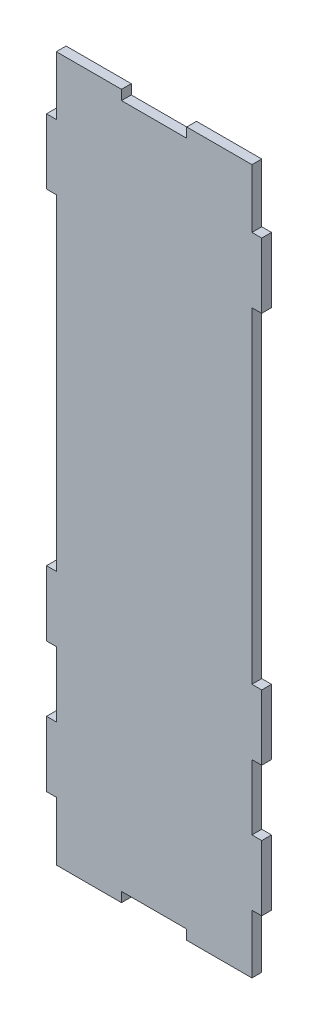
ISO-10303-21;
HEADER;
FILE_DESCRIPTION(('STEP AP214'),'2;1');
FILE_NAME('part.step','',(''),(''),'','','');
FILE_SCHEMA(('AUTOMOTIVE_DESIGN { 1 0 10303 214 1 1 1 1 }'));
ENDSEC;
DATA;
#1=APPLICATION_CONTEXT('core data for automotive mechanical design processes');
#2=APPLICATION_PROTOCOL_DEFINITION('international standard','automotive_design',2000,#1);
#3=PRODUCT_CONTEXT('',#1,'mechanical');
#4=PRODUCT('Part','Part','',(#3));
#5=PRODUCT_RELATED_PRODUCT_CATEGORY('part','',(#4));
#6=PRODUCT_DEFINITION_FORMATION('','',#4);
#7=PRODUCT_DEFINITION_CONTEXT('part definition',#1,'design');
#8=PRODUCT_DEFINITION('design','',#6,#7);
#9=PRODUCT_DEFINITION_SHAPE('','',#8);
#10=(LENGTH_UNIT() NAMED_UNIT(*) SI_UNIT(.MILLI.,.METRE.));
#11=(NAMED_UNIT(*) PLANE_ANGLE_UNIT() SI_UNIT($,.RADIAN.));
#12=(NAMED_UNIT(*) SI_UNIT($,.STERADIAN.) SOLID_ANGLE_UNIT());
#13=UNCERTAINTY_MEASURE_WITH_UNIT(LENGTH_MEASURE(1.E-05),#10,'distance_accuracy_value','');
#14=(GEOMETRIC_REPRESENTATION_CONTEXT(3) GLOBAL_UNCERTAINTY_ASSIGNED_CONTEXT((#13)) GLOBAL_UNIT_ASSIGNED_CONTEXT((#10,
#11,#12)) REPRESENTATION_CONTEXT('',''));
#15=CARTESIAN_POINT('',(0.,0.,0.));
#16=DIRECTION('',(0.,0.,1.));
#17=DIRECTION('',(1.,0.,0.));
#18=AXIS2_PLACEMENT_3D('',#15,#16,#17);
#19=CARTESIAN_POINT('',(-3.,0.,3.));
#20=DIRECTION('',(0.,-1.,0.));
#21=DIRECTION('',(0.,0.,-1.));
#22=AXIS2_PLACEMENT_3D('',#19,#20,#21);
#23=PLANE('',#22);
#24=DIRECTION('',(-1.,0.,0.));
#25=VECTOR('',#24,1.);
#26=CARTESIAN_POINT('',(-3.,0.,0.));
#27=LINE('',#26,#25);
#28=CARTESIAN_POINT('',(0.,0.,0.));
#29=VERTEX_POINT('',#28);
#30=CARTESIAN_POINT('',(-3.,0.,0.));
#31=VERTEX_POINT('',#30);
#32=EDGE_CURVE('E301',#29,#31,#27,.T.);
#33=ORIENTED_EDGE('',*,*,#32,.T.);
#34=DIRECTION('',(0.,0.,-1.));
#35=VECTOR('',#34,1.);
#36=CARTESIAN_POINT('',(-3.,0.,3.));
#37=LINE('',#36,#35);
#38=CARTESIAN_POINT('',(-3.,0.,3.));
#39=VERTEX_POINT('',#38);
#40=EDGE_CURVE('E11',#39,#31,#37,.T.);
#41=ORIENTED_EDGE('',*,*,#40,.F.);
#42=DIRECTION('',(-1.,0.,0.));
#43=VECTOR('',#42,1.);
#44=CARTESIAN_POINT('',(-3.,0.,3.));
#45=LINE('',#44,#43);
#46=CARTESIAN_POINT('',(0.,0.,3.));
#47=VERTEX_POINT('',#46);
#48=EDGE_CURVE('E371',#47,#39,#45,.T.);
#49=ORIENTED_EDGE('',*,*,#48,.F.);
#50=DIRECTION('',(0.,0.,-1.));
#51=VECTOR('',#50,1.);
#52=CARTESIAN_POINT('',(0.,0.,3.));
#53=LINE('',#52,#51);
#54=EDGE_CURVE('E297',#47,#29,#53,.T.);
#55=ORIENTED_EDGE('',*,*,#54,.T.);
#56=EDGE_LOOP('',(#33,#41,#49,#55));
#57=FACE_BOUND('',#56,.T.);
#58=ADVANCED_FACE('F37',(#57),#23,.F.);
#59=CARTESIAN_POINT('',(-3.,-20.,3.));
#60=DIRECTION('',(1.,0.,0.));
#61=DIRECTION('',(0.,0.,-1.));
#62=AXIS2_PLACEMENT_3D('',#59,#60,#61);
#63=PLANE('',#62);
#64=DIRECTION('',(0.,-1.,0.));
#65=VECTOR('',#64,1.);
#66=CARTESIAN_POINT('',(-3.,-20.,0.));
#67=LINE('',#66,#65);
#68=CARTESIAN_POINT('',(-3.,-20.,0.));
#69=VERTEX_POINT('',#68);
#70=EDGE_CURVE('E304',#31,#69,#67,.T.);
#71=ORIENTED_EDGE('',*,*,#70,.T.);
#72=DIRECTION('',(0.,0.,-1.));
#73=VECTOR('',#72,1.);
#74=CARTESIAN_POINT('',(-3.,-20.,3.));
#75=LINE('',#74,#73);
#76=CARTESIAN_POINT('',(-3.,-20.,3.));
#77=VERTEX_POINT('',#76);
#78=EDGE_CURVE('E45',#77,#69,#75,.T.);
#79=ORIENTED_EDGE('',*,*,#78,.F.);
#80=DIRECTION('',(0.,-1.,0.));
#81=VECTOR('',#80,1.);
#82=CARTESIAN_POINT('',(-3.,-20.,3.));
#83=LINE('',#82,#81);
#84=EDGE_CURVE('E180',#39,#77,#83,.T.);
#85=ORIENTED_EDGE('',*,*,#84,.F.);
#86=ORIENTED_EDGE('',*,*,#40,.T.);
#87=EDGE_LOOP('',(#71,#79,#85,#86));
#88=FACE_BOUND('',#87,.T.);
#89=ADVANCED_FACE('F569',(#88),#63,.F.);
#90=CARTESIAN_POINT('',(0.,-20.,3.));
#91=DIRECTION('',(0.,1.,0.));
#92=DIRECTION('',(0.,0.,1.));
#93=AXIS2_PLACEMENT_3D('',#90,#91,#92);
#94=PLANE('',#93);
#95=DIRECTION('',(1.,0.,0.));
#96=VECTOR('',#95,1.);
#97=CARTESIAN_POINT('',(0.,-20.,0.));
#98=LINE('',#97,#96);
#99=CARTESIAN_POINT('',(0.,-20.,0.));
#100=VERTEX_POINT('',#99);
#101=EDGE_CURVE('E306',#69,#100,#98,.T.);
#102=ORIENTED_EDGE('',*,*,#101,.T.);
#103=DIRECTION('',(0.,0.,-1.));
#104=VECTOR('',#103,1.);
#105=CARTESIAN_POINT('',(0.,-20.,3.));
#106=LINE('',#105,#104);
#107=CARTESIAN_POINT('',(0.,-20.,3.));
#108=VERTEX_POINT('',#107);
#109=EDGE_CURVE('E462',#108,#100,#106,.T.);
#110=ORIENTED_EDGE('',*,*,#109,.F.);
#111=DIRECTION('',(1.,0.,0.));
#112=VECTOR('',#111,1.);
#113=CARTESIAN_POINT('',(0.,-20.,3.));
#114=LINE('',#113,#112);
#115=EDGE_CURVE('E470',#77,#108,#114,.T.);
#116=ORIENTED_EDGE('',*,*,#115,.F.);
#117=ORIENTED_EDGE('',*,*,#78,.T.);
#118=EDGE_LOOP('',(#102,#110,#116,#117));
#119=FACE_BOUND('',#118,.T.);
#120=ADVANCED_FACE('F468',(#119),#94,.F.);
#121=CARTESIAN_POINT('',(0.,-40.,3.));
#122=DIRECTION('',(1.,0.,0.));
#123=DIRECTION('',(0.,0.,-1.));
#124=AXIS2_PLACEMENT_3D('',#121,#122,#123);
#125=PLANE('',#124);
#126=DIRECTION('',(0.,-1.,0.));
#127=VECTOR('',#126,1.);
#128=CARTESIAN_POINT('',(0.,-40.,0.));
#129=LINE('',#128,#127);
#130=CARTESIAN_POINT('',(0.,-40.,0.));
#131=VERTEX_POINT('',#130);
#132=EDGE_CURVE('E308',#100,#131,#129,.T.);
#133=ORIENTED_EDGE('',*,*,#132,.T.);
#134=DIRECTION('',(0.,0.,-1.));
#135=VECTOR('',#134,1.);
#136=CARTESIAN_POINT('',(0.,-40.,3.));
#137=LINE('',#136,#135);
#138=CARTESIAN_POINT('',(0.,-40.,3.));
#139=VERTEX_POINT('',#138);
#140=EDGE_CURVE('E459',#139,#131,#137,.T.);
#141=ORIENTED_EDGE('',*,*,#140,.F.);
#142=DIRECTION('',(0.,-1.,0.));
#143=VECTOR('',#142,1.);
#144=CARTESIAN_POINT('',(0.,-40.,3.));
#145=LINE('',#144,#143);
#146=EDGE_CURVE('E488',#108,#139,#145,.T.);
#147=ORIENTED_EDGE('',*,*,#146,.F.);
#148=ORIENTED_EDGE('',*,*,#109,.T.);
#149=EDGE_LOOP('',(#133,#141,#147,#148));
#150=FACE_BOUND('',#149,.T.);
#151=ADVANCED_FACE('F479',(#150),#125,.F.);
#152=CARTESIAN_POINT('',(-3.,-40.,3.));
#153=DIRECTION('',(0.,-1.,0.));
#154=DIRECTION('',(0.,0.,-1.));
#155=AXIS2_PLACEMENT_3D('',#152,#153,#154);
#156=PLANE('',#155);
#157=DIRECTION('',(-1.,0.,0.));
#158=VECTOR('',#157,1.);
#159=CARTESIAN_POINT('',(-3.,-40.,0.));
#160=LINE('',#159,#158);
#161=CARTESIAN_POINT('',(-3.,-40.,0.));
#162=VERTEX_POINT('',#161);
#163=EDGE_CURVE('E310',#131,#162,#160,.T.);
#164=ORIENTED_EDGE('',*,*,#163,.T.);
#165=DIRECTION('',(0.,0.,-1.));
#166=VECTOR('',#165,1.);
#167=CARTESIAN_POINT('',(-3.,-40.,3.));
#168=LINE('',#167,#166);
#169=CARTESIAN_POINT('',(-3.,-40.,3.));
#170=VERTEX_POINT('',#169);
#171=EDGE_CURVE('E456',#170,#162,#168,.T.);
#172=ORIENTED_EDGE('',*,*,#171,.F.);
#173=DIRECTION('',(-1.,0.,0.));
#174=VECTOR('',#173,1.);
#175=CARTESIAN_POINT('',(-3.,-40.,3.));
#176=LINE('',#175,#174);
#177=EDGE_CURVE('E485',#139,#170,#176,.T.);
#178=ORIENTED_EDGE('',*,*,#177,.F.);
#179=ORIENTED_EDGE('',*,*,#140,.T.);
#180=EDGE_LOOP('',(#164,#172,#178,#179));
#181=FACE_BOUND('',#180,.T.);
#182=ADVANCED_FACE('F483',(#181),#156,.F.);
#183=CARTESIAN_POINT('',(-3.,-60.,3.));
#184=DIRECTION('',(1.,0.,0.));
#185=DIRECTION('',(0.,0.,-1.));
#186=AXIS2_PLACEMENT_3D('',#183,#184,#185);
#187=PLANE('',#186);
#188=DIRECTION('',(0.,-1.,0.));
#189=VECTOR('',#188,1.);
#190=CARTESIAN_POINT('',(-3.,-60.,0.));
#191=LINE('',#190,#189);
#192=CARTESIAN_POINT('',(-3.,-60.,0.));
#193=VERTEX_POINT('',#192);
#194=EDGE_CURVE('E312',#162,#193,#191,.T.);
#195=ORIENTED_EDGE('',*,*,#194,.T.);
#196=DIRECTION('',(0.,0.,-1.));
#197=VECTOR('',#196,1.);
#198=CARTESIAN_POINT('',(-3.,-60.,3.));
#199=LINE('',#198,#197);
#200=CARTESIAN_POINT('',(-3.,-60.,3.));
#201=VERTEX_POINT('',#200);
#202=EDGE_CURVE('E453',#201,#193,#199,.T.);
#203=ORIENTED_EDGE('',*,*,#202,.F.);
#204=DIRECTION('',(0.,-1.,0.));
#205=VECTOR('',#204,1.);
#206=CARTESIAN_POINT('',(-3.,-60.,3.));
#207=LINE('',#206,#205);
#208=EDGE_CURVE('E487',#170,#201,#207,.T.);
#209=ORIENTED_EDGE('',*,*,#208,.F.);
#210=ORIENTED_EDGE('',*,*,#171,.T.);
#211=EDGE_LOOP('',(#195,#203,#209,#210));
#212=FACE_BOUND('',#211,.T.);
#213=ADVANCED_FACE('F582',(#212),#187,.F.);
#214=CARTESIAN_POINT('',(0.,-60.,3.));
#215=DIRECTION('',(0.,1.,0.));
#216=DIRECTION('',(0.,0.,1.));
#217=AXIS2_PLACEMENT_3D('',#214,#215,#216);
#218=PLANE('',#217);
#219=DIRECTION('',(1.,0.,0.));
#220=VECTOR('',#219,1.);
#221=CARTESIAN_POINT('',(0.,-60.,0.));
#222=LINE('',#221,#220);
#223=CARTESIAN_POINT('',(0.,-60.,0.));
#224=VERTEX_POINT('',#223);
#225=EDGE_CURVE('E314',#193,#224,#222,.T.);
#226=ORIENTED_EDGE('',*,*,#225,.T.);
#227=DIRECTION('',(0.,0.,-1.));
#228=VECTOR('',#227,1.);
#229=CARTESIAN_POINT('',(0.,-60.,3.));
#230=LINE('',#229,#228);
#231=CARTESIAN_POINT('',(0.,-60.,3.));
#232=VERTEX_POINT('',#231);
#233=EDGE_CURVE('E450',#232,#224,#230,.T.);
#234=ORIENTED_EDGE('',*,*,#233,.F.);
#235=DIRECTION('',(1.,0.,0.));
#236=VECTOR('',#235,1.);
#237=CARTESIAN_POINT('',(0.,-60.,3.));
#238=LINE('',#237,#236);
#239=EDGE_CURVE('E490',#201,#232,#238,.T.);
#240=ORIENTED_EDGE('',*,*,#239,.F.);
#241=ORIENTED_EDGE('',*,*,#202,.T.);
#242=EDGE_LOOP('',(#226,#234,#240,#241));
#243=FACE_BOUND('',#242,.T.);
#244=ADVANCED_FACE('F585',(#243),#218,.F.);
#245=CARTESIAN_POINT('',(0.,-78.,3.));
#246=DIRECTION('',(1.,0.,0.));
#247=DIRECTION('',(0.,0.,-1.));
#248=AXIS2_PLACEMENT_3D('',#245,#246,#247);
#249=PLANE('',#248);
#250=DIRECTION('',(0.,-1.,0.));
#251=VECTOR('',#250,1.);
#252=CARTESIAN_POINT('',(0.,-78.,0.));
#253=LINE('',#252,#251);
#254=CARTESIAN_POINT('',(0.,-78.,0.));
#255=VERTEX_POINT('',#254);
#256=EDGE_CURVE('E316',#224,#255,#253,.T.);
#257=ORIENTED_EDGE('',*,*,#256,.T.);
#258=DIRECTION('',(0.,0.,-1.));
#259=VECTOR('',#258,1.);
#260=CARTESIAN_POINT('',(0.,-78.,3.));
#261=LINE('',#260,#259);
#262=CARTESIAN_POINT('',(0.,-78.,3.));
#263=VERTEX_POINT('',#262);
#264=EDGE_CURVE('E447',#263,#255,#261,.T.);
#265=ORIENTED_EDGE('',*,*,#264,.F.);
#266=DIRECTION('',(0.,-1.,0.));
#267=VECTOR('',#266,1.);
#268=CARTESIAN_POINT('',(0.,-78.,3.));
#269=LINE('',#268,#267);
#270=EDGE_CURVE('E496',#232,#263,#269,.T.);
#271=ORIENTED_EDGE('',*,*,#270,.F.);
#272=ORIENTED_EDGE('',*,*,#233,.T.);
#273=EDGE_LOOP('',(#257,#265,#271,#272));
#274=FACE_BOUND('',#273,.T.);
#275=ADVANCED_FACE('F589',(#274),#249,.F.);
#276=CARTESIAN_POINT('',(20.,-78.,3.));
#277=DIRECTION('',(0.,1.,0.));
#278=DIRECTION('',(-1.,0.,0.));
#279=AXIS2_PLACEMENT_3D('',#276,#277,#278);
#280=PLANE('',#279);
#281=DIRECTION('',(1.,0.,0.));
#282=VECTOR('',#281,1.);
#283=CARTESIAN_POINT('',(20.,-78.,0.));
#284=LINE('',#283,#282);
#285=CARTESIAN_POINT('',(20.,-78.,0.));
#286=VERTEX_POINT('',#285);
#287=EDGE_CURVE('E318',#255,#286,#284,.T.);
#288=ORIENTED_EDGE('',*,*,#287,.T.);
#289=DIRECTION('',(0.,0.,-1.));
#290=VECTOR('',#289,1.);
#291=CARTESIAN_POINT('',(20.,-78.,3.));
#292=LINE('',#291,#290);
#293=CARTESIAN_POINT('',(20.,-78.,3.));
#294=VERTEX_POINT('',#293);
#295=EDGE_CURVE('E444',#294,#286,#292,.T.);
#296=ORIENTED_EDGE('',*,*,#295,.F.);
#297=DIRECTION('',(1.,0.,0.));
#298=VECTOR('',#297,1.);
#299=CARTESIAN_POINT('',(20.,-78.,3.));
#300=LINE('',#299,#298);
#301=EDGE_CURVE('E498',#263,#294,#300,.T.);
#302=ORIENTED_EDGE('',*,*,#301,.F.);
#303=ORIENTED_EDGE('',*,*,#264,.T.);
#304=EDGE_LOOP('',(#288,#296,#302,#303));
#305=FACE_BOUND('',#304,.T.);
#306=ADVANCED_FACE('F593',(#305),#280,.F.);
#307=CARTESIAN_POINT('',(20.,-78.,3.));
#308=DIRECTION('',(-1.,0.,0.));
#309=DIRECTION('',(0.,0.,1.));
#310=AXIS2_PLACEMENT_3D('',#307,#308,#309);
#311=PLANE('',#310);
#312=DIRECTION('',(0.,1.,0.));
#313=VECTOR('',#312,1.);
#314=CARTESIAN_POINT('',(20.,-78.,0.));
#315=LINE('',#314,#313);
#316=CARTESIAN_POINT('',(20.,-75.,0.));
#317=VERTEX_POINT('',#316);
#318=EDGE_CURVE('E320',#286,#317,#315,.T.);
#319=ORIENTED_EDGE('',*,*,#318,.T.);
#320=DIRECTION('',(0.,0.,-1.));
#321=VECTOR('',#320,1.);
#322=CARTESIAN_POINT('',(20.,-75.,3.));
#323=LINE('',#322,#321);
#324=CARTESIAN_POINT('',(20.,-75.,3.));
#325=VERTEX_POINT('',#324);
#326=EDGE_CURVE('E441',#325,#317,#323,.T.);
#327=ORIENTED_EDGE('',*,*,#326,.F.);
#328=DIRECTION('',(0.,1.,0.));
#329=VECTOR('',#328,1.);
#330=CARTESIAN_POINT('',(20.,-78.,3.));
#331=LINE('',#330,#329);
#332=EDGE_CURVE('E500',#294,#325,#331,.T.);
#333=ORIENTED_EDGE('',*,*,#332,.F.);
#334=ORIENTED_EDGE('',*,*,#295,.T.);
#335=EDGE_LOOP('',(#319,#327,#333,#334));
#336=FACE_BOUND('',#335,.T.);
#337=ADVANCED_FACE('F597',(#336),#311,.F.);
#338=CARTESIAN_POINT('',(20.,-75.,3.));
#339=DIRECTION('',(0.,1.,0.));
#340=DIRECTION('',(0.,0.,1.));
#341=AXIS2_PLACEMENT_3D('',#338,#339,#340);
#342=PLANE('',#341);
#343=DIRECTION('',(1.,0.,0.));
#344=VECTOR('',#343,1.);
#345=CARTESIAN_POINT('',(20.,-75.,0.));
#346=LINE('',#345,#344);
#347=CARTESIAN_POINT('',(40.,-75.,0.));
#348=VERTEX_POINT('',#347);
#349=EDGE_CURVE('E322',#317,#348,#346,.T.);
#350=ORIENTED_EDGE('',*,*,#349,.T.);
#351=DIRECTION('',(0.,0.,-1.));
#352=VECTOR('',#351,1.);
#353=CARTESIAN_POINT('',(40.,-75.,3.));
#354=LINE('',#353,#352);
#355=CARTESIAN_POINT('',(40.,-75.,3.));
#356=VERTEX_POINT('',#355);
#357=EDGE_CURVE('E438',#356,#348,#354,.T.);
#358=ORIENTED_EDGE('',*,*,#357,.F.);
#359=DIRECTION('',(1.,0.,0.));
#360=VECTOR('',#359,1.);
#361=CARTESIAN_POINT('',(20.,-75.,3.));
#362=LINE('',#361,#360);
#363=EDGE_CURVE('E502',#325,#356,#362,.T.);
#364=ORIENTED_EDGE('',*,*,#363,.F.);
#365=ORIENTED_EDGE('',*,*,#326,.T.);
#366=EDGE_LOOP('',(#350,#358,#364,#365));
#367=FACE_BOUND('',#366,.T.);
#368=ADVANCED_FACE('F601',(#367),#342,.F.);
#369=CARTESIAN_POINT('',(40.,-75.,3.));
#370=DIRECTION('',(1.,0.,0.));
#371=DIRECTION('',(0.,0.,-1.));
#372=AXIS2_PLACEMENT_3D('',#369,#370,#371);
#373=PLANE('',#372);
#374=DIRECTION('',(0.,-1.,0.));
#375=VECTOR('',#374,1.);
#376=CARTESIAN_POINT('',(40.,-75.,0.));
#377=LINE('',#376,#375);
#378=CARTESIAN_POINT('',(40.,-78.,0.));
#379=VERTEX_POINT('',#378);
#380=EDGE_CURVE('E324',#348,#379,#377,.T.);
#381=ORIENTED_EDGE('',*,*,#380,.T.);
#382=DIRECTION('',(0.,0.,-1.));
#383=VECTOR('',#382,1.);
#384=CARTESIAN_POINT('',(40.,-78.,3.));
#385=LINE('',#384,#383);
#386=CARTESIAN_POINT('',(40.,-78.,3.));
#387=VERTEX_POINT('',#386);
#388=EDGE_CURVE('E435',#387,#379,#385,.T.);
#389=ORIENTED_EDGE('',*,*,#388,.F.);
#390=DIRECTION('',(0.,-1.,0.));
#391=VECTOR('',#390,1.);
#392=CARTESIAN_POINT('',(40.,-75.,3.));
#393=LINE('',#392,#391);
#394=EDGE_CURVE('E504',#356,#387,#393,.T.);
#395=ORIENTED_EDGE('',*,*,#394,.F.);
#396=ORIENTED_EDGE('',*,*,#357,.T.);
#397=EDGE_LOOP('',(#381,#389,#395,#396));
#398=FACE_BOUND('',#397,.T.);
#399=ADVANCED_FACE('F605',(#398),#373,.F.);
#400=CARTESIAN_POINT('',(60.,-78.,3.));
#401=DIRECTION('',(0.,1.,0.));
#402=DIRECTION('',(0.,0.,1.));
#403=AXIS2_PLACEMENT_3D('',#400,#401,#402);
#404=PLANE('',#403);
#405=DIRECTION('',(1.,0.,0.));
#406=VECTOR('',#405,1.);
#407=CARTESIAN_POINT('',(60.,-78.,0.));
#408=LINE('',#407,#406);
#409=CARTESIAN_POINT('',(60.,-78.,0.));
#410=VERTEX_POINT('',#409);
#411=EDGE_CURVE('E326',#379,#410,#408,.T.);
#412=ORIENTED_EDGE('',*,*,#411,.T.);
#413=DIRECTION('',(0.,0.,-1.));
#414=VECTOR('',#413,1.);
#415=CARTESIAN_POINT('',(60.,-78.,3.));
#416=LINE('',#415,#414);
#417=CARTESIAN_POINT('',(60.,-78.,3.));
#418=VERTEX_POINT('',#417);
#419=EDGE_CURVE('E432',#418,#410,#416,.T.);
#420=ORIENTED_EDGE('',*,*,#419,.F.);
#421=DIRECTION('',(1.,0.,0.));
#422=VECTOR('',#421,1.);
#423=CARTESIAN_POINT('',(60.,-78.,3.));
#424=LINE('',#423,#422);
#425=EDGE_CURVE('E506',#387,#418,#424,.T.);
#426=ORIENTED_EDGE('',*,*,#425,.F.);
#427=ORIENTED_EDGE('',*,*,#388,.T.);
#428=EDGE_LOOP('',(#412,#420,#426,#427));
#429=FACE_BOUND('',#428,.T.);
#430=ADVANCED_FACE('F609',(#429),#404,.F.);
#431=CARTESIAN_POINT('',(60.,-60.,3.));
#432=DIRECTION('',(-1.,0.,0.));
#433=DIRECTION('',(0.,-1.,0.));
#434=AXIS2_PLACEMENT_3D('',#431,#432,#433);
#435=PLANE('',#434);
#436=DIRECTION('',(0.,1.,0.));
#437=VECTOR('',#436,1.);
#438=CARTESIAN_POINT('',(60.,-60.,0.));
#439=LINE('',#438,#437);
#440=CARTESIAN_POINT('',(60.,-60.,0.));
#441=VERTEX_POINT('',#440);
#442=EDGE_CURVE('E328',#410,#441,#439,.T.);
#443=ORIENTED_EDGE('',*,*,#442,.T.);
#444=DIRECTION('',(0.,0.,-1.));
#445=VECTOR('',#444,1.);
#446=CARTESIAN_POINT('',(60.,-60.,3.));
#447=LINE('',#446,#445);
#448=CARTESIAN_POINT('',(60.,-60.,3.));
#449=VERTEX_POINT('',#448);
#450=EDGE_CURVE('E429',#449,#441,#447,.T.);
#451=ORIENTED_EDGE('',*,*,#450,.F.);
#452=DIRECTION('',(0.,1.,0.));
#453=VECTOR('',#452,1.);
#454=CARTESIAN_POINT('',(60.,-60.,3.));
#455=LINE('',#454,#453);
#456=EDGE_CURVE('E508',#418,#449,#455,.T.);
#457=ORIENTED_EDGE('',*,*,#456,.F.);
#458=ORIENTED_EDGE('',*,*,#419,.T.);
#459=EDGE_LOOP('',(#443,#451,#457,#458));
#460=FACE_BOUND('',#459,.T.);
#461=ADVANCED_FACE('F613',(#460),#435,.F.);
#462=CARTESIAN_POINT('',(63.,-60.,3.));
#463=DIRECTION('',(0.,1.,0.));
#464=DIRECTION('',(0.,0.,1.));
#465=AXIS2_PLACEMENT_3D('',#462,#463,#464);
#466=PLANE('',#465);
#467=DIRECTION('',(1.,0.,0.));
#468=VECTOR('',#467,1.);
#469=CARTESIAN_POINT('',(63.,-60.,0.));
#470=LINE('',#469,#468);
#471=CARTESIAN_POINT('',(63.,-60.,0.));
#472=VERTEX_POINT('',#471);
#473=EDGE_CURVE('E330',#441,#472,#470,.T.);
#474=ORIENTED_EDGE('',*,*,#473,.T.);
#475=DIRECTION('',(0.,0.,-1.));
#476=VECTOR('',#475,1.);
#477=CARTESIAN_POINT('',(63.,-60.,3.));
#478=LINE('',#477,#476);
#479=CARTESIAN_POINT('',(63.,-60.,3.));
#480=VERTEX_POINT('',#479);
#481=EDGE_CURVE('E426',#480,#472,#478,.T.);
#482=ORIENTED_EDGE('',*,*,#481,.F.);
#483=DIRECTION('',(1.,0.,0.));
#484=VECTOR('',#483,1.);
#485=CARTESIAN_POINT('',(63.,-60.,3.));
#486=LINE('',#485,#484);
#487=EDGE_CURVE('E510',#449,#480,#486,.T.);
#488=ORIENTED_EDGE('',*,*,#487,.F.);
#489=ORIENTED_EDGE('',*,*,#450,.T.);
#490=EDGE_LOOP('',(#474,#482,#488,#489));
#491=FACE_BOUND('',#490,.T.);
#492=ADVANCED_FACE('F617',(#491),#466,.F.);
#493=CARTESIAN_POINT('',(63.,-40.,3.));
#494=DIRECTION('',(-1.,0.,0.));
#495=DIRECTION('',(0.,0.,1.));
#496=AXIS2_PLACEMENT_3D('',#493,#494,#495);
#497=PLANE('',#496);
#498=DIRECTION('',(0.,1.,0.));
#499=VECTOR('',#498,1.);
#500=CARTESIAN_POINT('',(63.,-40.,0.));
#501=LINE('',#500,#499);
#502=CARTESIAN_POINT('',(63.,-40.,0.));
#503=VERTEX_POINT('',#502);
#504=EDGE_CURVE('E332',#472,#503,#501,.T.);
#505=ORIENTED_EDGE('',*,*,#504,.T.);
#506=DIRECTION('',(0.,0.,-1.));
#507=VECTOR('',#506,1.);
#508=CARTESIAN_POINT('',(63.,-40.,3.));
#509=LINE('',#508,#507);
#510=CARTESIAN_POINT('',(63.,-40.,3.));
#511=VERTEX_POINT('',#510);
#512=EDGE_CURVE('E423',#511,#503,#509,.T.);
#513=ORIENTED_EDGE('',*,*,#512,.F.);
#514=DIRECTION('',(0.,1.,0.));
#515=VECTOR('',#514,1.);
#516=CARTESIAN_POINT('',(63.,-40.,3.));
#517=LINE('',#516,#515);
#518=EDGE_CURVE('E512',#480,#511,#517,.T.);
#519=ORIENTED_EDGE('',*,*,#518,.F.);
#520=ORIENTED_EDGE('',*,*,#481,.T.);
#521=EDGE_LOOP('',(#505,#513,#519,#520));
#522=FACE_BOUND('',#521,.T.);
#523=ADVANCED_FACE('F621',(#522),#497,.F.);
#524=CARTESIAN_POINT('',(60.,-40.,3.));
#525=DIRECTION('',(0.,-1.,0.));
#526=DIRECTION('',(0.,0.,-1.));
#527=AXIS2_PLACEMENT_3D('',#524,#525,#526);
#528=PLANE('',#527);
#529=DIRECTION('',(-1.,0.,0.));
#530=VECTOR('',#529,1.);
#531=CARTESIAN_POINT('',(60.,-40.,0.));
#532=LINE('',#531,#530);
#533=CARTESIAN_POINT('',(60.,-40.,0.));
#534=VERTEX_POINT('',#533);
#535=EDGE_CURVE('E334',#503,#534,#532,.T.);
#536=ORIENTED_EDGE('',*,*,#535,.T.);
#537=DIRECTION('',(0.,0.,-1.));
#538=VECTOR('',#537,1.);
#539=CARTESIAN_POINT('',(60.,-40.,3.));
#540=LINE('',#539,#538);
#541=CARTESIAN_POINT('',(60.,-40.,3.));
#542=VERTEX_POINT('',#541);
#543=EDGE_CURVE('E420',#542,#534,#540,.T.);
#544=ORIENTED_EDGE('',*,*,#543,.F.);
#545=DIRECTION('',(-1.,0.,0.));
#546=VECTOR('',#545,1.);
#547=CARTESIAN_POINT('',(60.,-40.,3.));
#548=LINE('',#547,#546);
#549=EDGE_CURVE('E514',#511,#542,#548,.T.);
#550=ORIENTED_EDGE('',*,*,#549,.F.);
#551=ORIENTED_EDGE('',*,*,#512,.T.);
#552=EDGE_LOOP('',(#536,#544,#550,#551));
#553=FACE_BOUND('',#552,.T.);
#554=ADVANCED_FACE('F625',(#553),#528,.F.);
#555=CARTESIAN_POINT('',(59.9999999999999,-20.,3.));
#556=DIRECTION('',(-1.,0.,0.));
#557=DIRECTION('',(0.,-1.,0.));
#558=AXIS2_PLACEMENT_3D('',#555,#556,#557);
#559=PLANE('',#558);
#560=DIRECTION('',(0.,1.,0.));
#561=VECTOR('',#560,1.);
#562=CARTESIAN_POINT('',(59.9999999999999,-20.,0.));
#563=LINE('',#562,#561);
#564=CARTESIAN_POINT('',(59.9999999999999,-20.,0.));
#565=VERTEX_POINT('',#564);
#566=EDGE_CURVE('E336',#534,#565,#563,.T.);
#567=ORIENTED_EDGE('',*,*,#566,.T.);
#568=DIRECTION('',(0.,0.,-1.));
#569=VECTOR('',#568,1.);
#570=CARTESIAN_POINT('',(59.9999999999999,-20.,3.));
#571=LINE('',#570,#569);
#572=CARTESIAN_POINT('',(59.9999999999999,-20.,3.));
#573=VERTEX_POINT('',#572);
#574=EDGE_CURVE('E417',#573,#565,#571,.T.);
#575=ORIENTED_EDGE('',*,*,#574,.F.);
#576=DIRECTION('',(0.,1.,0.));
#577=VECTOR('',#576,1.);
#578=CARTESIAN_POINT('',(59.9999999999999,-20.,3.));
#579=LINE('',#578,#577);
#580=EDGE_CURVE('E516',#542,#573,#579,.T.);
#581=ORIENTED_EDGE('',*,*,#580,.F.);
#582=ORIENTED_EDGE('',*,*,#543,.T.);
#583=EDGE_LOOP('',(#567,#575,#581,#582));
#584=FACE_BOUND('',#583,.T.);
#585=ADVANCED_FACE('F629',(#584),#559,.F.);
#586=CARTESIAN_POINT('',(63.,-20.,3.));
#587=DIRECTION('',(0.,1.,0.));
#588=DIRECTION('',(0.,0.,1.));
#589=AXIS2_PLACEMENT_3D('',#586,#587,#588);
#590=PLANE('',#589);
#591=DIRECTION('',(1.,0.,0.));
#592=VECTOR('',#591,1.);
#593=CARTESIAN_POINT('',(63.,-20.,0.));
#594=LINE('',#593,#592);
#595=CARTESIAN_POINT('',(63.,-20.,0.));
#596=VERTEX_POINT('',#595);
#597=EDGE_CURVE('E338',#565,#596,#594,.T.);
#598=ORIENTED_EDGE('',*,*,#597,.T.);
#599=DIRECTION('',(0.,0.,-1.));
#600=VECTOR('',#599,1.);
#601=CARTESIAN_POINT('',(63.,-20.,3.));
#602=LINE('',#601,#600);
#603=CARTESIAN_POINT('',(63.,-20.,3.));
#604=VERTEX_POINT('',#603);
#605=EDGE_CURVE('E414',#604,#596,#602,.T.);
#606=ORIENTED_EDGE('',*,*,#605,.F.);
#607=DIRECTION('',(1.,0.,0.));
#608=VECTOR('',#607,1.);
#609=CARTESIAN_POINT('',(63.,-20.,3.));
#610=LINE('',#609,#608);
#611=EDGE_CURVE('E518',#573,#604,#610,.T.);
#612=ORIENTED_EDGE('',*,*,#611,.F.);
#613=ORIENTED_EDGE('',*,*,#574,.T.);
#614=EDGE_LOOP('',(#598,#606,#612,#613));
#615=FACE_BOUND('',#614,.T.);
#616=ADVANCED_FACE('F633',(#615),#590,.F.);
#617=CARTESIAN_POINT('',(63.,0.,3.));
#618=DIRECTION('',(-1.,0.,0.));
#619=DIRECTION('',(0.,-1.,0.));
#620=AXIS2_PLACEMENT_3D('',#617,#618,#619);
#621=PLANE('',#620);
#622=DIRECTION('',(0.,1.,0.));
#623=VECTOR('',#622,1.);
#624=CARTESIAN_POINT('',(63.,0.,0.));
#625=LINE('',#624,#623);
#626=CARTESIAN_POINT('',(63.,0.,0.));
#627=VERTEX_POINT('',#626);
#628=EDGE_CURVE('E340',#596,#627,#625,.T.);
#629=ORIENTED_EDGE('',*,*,#628,.T.);
#630=DIRECTION('',(0.,0.,-1.));
#631=VECTOR('',#630,1.);
#632=CARTESIAN_POINT('',(63.,0.,3.));
#633=LINE('',#632,#631);
#634=CARTESIAN_POINT('',(63.,0.,3.));
#635=VERTEX_POINT('',#634);
#636=EDGE_CURVE('E411',#635,#627,#633,.T.);
#637=ORIENTED_EDGE('',*,*,#636,.F.);
#638=DIRECTION('',(0.,1.,0.));
#639=VECTOR('',#638,1.);
#640=CARTESIAN_POINT('',(63.,0.,3.));
#641=LINE('',#640,#639);
#642=EDGE_CURVE('E520',#604,#635,#641,.T.);
#643=ORIENTED_EDGE('',*,*,#642,.F.);
#644=ORIENTED_EDGE('',*,*,#605,.T.);
#645=EDGE_LOOP('',(#629,#637,#643,#644));
#646=FACE_BOUND('',#645,.T.);
#647=ADVANCED_FACE('F637',(#646),#621,.F.);
#648=CARTESIAN_POINT('',(60.,0.,3.));
#649=DIRECTION('',(0.,-1.,0.));
#650=DIRECTION('',(0.,0.,-1.));
#651=AXIS2_PLACEMENT_3D('',#648,#649,#650);
#652=PLANE('',#651);
#653=DIRECTION('',(-1.,0.,0.));
#654=VECTOR('',#653,1.);
#655=CARTESIAN_POINT('',(60.,0.,0.));
#656=LINE('',#655,#654);
#657=CARTESIAN_POINT('',(60.,0.,0.));
#658=VERTEX_POINT('',#657);
#659=EDGE_CURVE('E342',#627,#658,#656,.T.);
#660=ORIENTED_EDGE('',*,*,#659,.T.);
#661=DIRECTION('',(0.,0.,-1.));
#662=VECTOR('',#661,1.);
#663=CARTESIAN_POINT('',(60.,0.,3.));
#664=LINE('',#663,#662);
#665=CARTESIAN_POINT('',(60.,0.,3.));
#666=VERTEX_POINT('',#665);
#667=EDGE_CURVE('E408',#666,#658,#664,.T.);
#668=ORIENTED_EDGE('',*,*,#667,.F.);
#669=DIRECTION('',(-1.,0.,0.));
#670=VECTOR('',#669,1.);
#671=CARTESIAN_POINT('',(60.,0.,3.));
#672=LINE('',#671,#670);
#673=EDGE_CURVE('E522',#635,#666,#672,.T.);
#674=ORIENTED_EDGE('',*,*,#673,.F.);
#675=ORIENTED_EDGE('',*,*,#636,.T.);
#676=EDGE_LOOP('',(#660,#668,#674,#675));
#677=FACE_BOUND('',#676,.T.);
#678=ADVANCED_FACE('F641',(#677),#652,.F.);
#679=CARTESIAN_POINT('',(60.,100.,3.));
#680=DIRECTION('',(-1.,0.,0.));
#681=DIRECTION('',(0.,-1.,0.));
#682=AXIS2_PLACEMENT_3D('',#679,#680,#681);
#683=PLANE('',#682);
#684=DIRECTION('',(0.,1.,0.));
#685=VECTOR('',#684,1.);
#686=CARTESIAN_POINT('',(60.,100.,0.));
#687=LINE('',#686,#685);
#688=CARTESIAN_POINT('',(60.,100.,0.));
#689=VERTEX_POINT('',#688);
#690=EDGE_CURVE('E344',#658,#689,#687,.T.);
#691=ORIENTED_EDGE('',*,*,#690,.T.);
#692=DIRECTION('',(0.,0.,-1.));
#693=VECTOR('',#692,1.);
#694=CARTESIAN_POINT('',(60.,100.,3.));
#695=LINE('',#694,#693);
#696=CARTESIAN_POINT('',(60.,100.,3.));
#697=VERTEX_POINT('',#696);
#698=EDGE_CURVE('E405',#697,#689,#695,.T.);
#699=ORIENTED_EDGE('',*,*,#698,.F.);
#700=DIRECTION('',(0.,1.,0.));
#701=VECTOR('',#700,1.);
#702=CARTESIAN_POINT('',(60.,100.,3.));
#703=LINE('',#702,#701);
#704=EDGE_CURVE('E524',#666,#697,#703,.T.);
#705=ORIENTED_EDGE('',*,*,#704,.F.);
#706=ORIENTED_EDGE('',*,*,#667,.T.);
#707=EDGE_LOOP('',(#691,#699,#705,#706));
#708=FACE_BOUND('',#707,.T.);
#709=ADVANCED_FACE('F645',(#708),#683,.F.);
#710=CARTESIAN_POINT('',(63.,100.,3.));
#711=DIRECTION('',(0.,1.,0.));
#712=DIRECTION('',(0.,0.,1.));
#713=AXIS2_PLACEMENT_3D('',#710,#711,#712);
#714=PLANE('',#713);
#715=DIRECTION('',(1.,0.,0.));
#716=VECTOR('',#715,1.);
#717=CARTESIAN_POINT('',(63.,100.,0.));
#718=LINE('',#717,#716);
#719=CARTESIAN_POINT('',(63.,100.,0.));
#720=VERTEX_POINT('',#719);
#721=EDGE_CURVE('E346',#689,#720,#718,.T.);
#722=ORIENTED_EDGE('',*,*,#721,.T.);
#723=DIRECTION('',(0.,0.,-1.));
#724=VECTOR('',#723,1.);
#725=CARTESIAN_POINT('',(63.,100.,3.));
#726=LINE('',#725,#724);
#727=CARTESIAN_POINT('',(63.,100.,3.));
#728=VERTEX_POINT('',#727);
#729=EDGE_CURVE('E402',#728,#720,#726,.T.);
#730=ORIENTED_EDGE('',*,*,#729,.F.);
#731=DIRECTION('',(1.,0.,0.));
#732=VECTOR('',#731,1.);
#733=CARTESIAN_POINT('',(63.,100.,3.));
#734=LINE('',#733,#732);
#735=EDGE_CURVE('E526',#697,#728,#734,.T.);
#736=ORIENTED_EDGE('',*,*,#735,.F.);
#737=ORIENTED_EDGE('',*,*,#698,.T.);
#738=EDGE_LOOP('',(#722,#730,#736,#737));
#739=FACE_BOUND('',#738,.T.);
#740=ADVANCED_FACE('F649',(#739),#714,.F.);
#741=CARTESIAN_POINT('',(63.,120.,3.));
#742=DIRECTION('',(-1.,0.,0.));
#743=DIRECTION('',(0.,0.,1.));
#744=AXIS2_PLACEMENT_3D('',#741,#742,#743);
#745=PLANE('',#744);
#746=DIRECTION('',(0.,1.,0.));
#747=VECTOR('',#746,1.);
#748=CARTESIAN_POINT('',(63.,120.,0.));
#749=LINE('',#748,#747);
#750=CARTESIAN_POINT('',(63.,120.,0.));
#751=VERTEX_POINT('',#750);
#752=EDGE_CURVE('E348',#720,#751,#749,.T.);
#753=ORIENTED_EDGE('',*,*,#752,.T.);
#754=DIRECTION('',(0.,0.,-1.));
#755=VECTOR('',#754,1.);
#756=CARTESIAN_POINT('',(63.,120.,3.));
#757=LINE('',#756,#755);
#758=CARTESIAN_POINT('',(63.,120.,3.));
#759=VERTEX_POINT('',#758);
#760=EDGE_CURVE('E399',#759,#751,#757,.T.);
#761=ORIENTED_EDGE('',*,*,#760,.F.);
#762=DIRECTION('',(0.,1.,0.));
#763=VECTOR('',#762,1.);
#764=CARTESIAN_POINT('',(63.,120.,3.));
#765=LINE('',#764,#763);
#766=EDGE_CURVE('E528',#728,#759,#765,.T.);
#767=ORIENTED_EDGE('',*,*,#766,.F.);
#768=ORIENTED_EDGE('',*,*,#729,.T.);
#769=EDGE_LOOP('',(#753,#761,#767,#768));
#770=FACE_BOUND('',#769,.T.);
#771=ADVANCED_FACE('F653',(#770),#745,.F.);
#772=CARTESIAN_POINT('',(63.,120.,3.));
#773=DIRECTION('',(0.,-1.,0.));
#774=DIRECTION('',(0.,0.,-1.));
#775=AXIS2_PLACEMENT_3D('',#772,#773,#774);
#776=PLANE('',#775);
#777=DIRECTION('',(-1.,0.,0.));
#778=VECTOR('',#777,1.);
#779=CARTESIAN_POINT('',(63.,120.,0.));
#780=LINE('',#779,#778);
#781=CARTESIAN_POINT('',(60.,120.,0.));
#782=VERTEX_POINT('',#781);
#783=EDGE_CURVE('E350',#751,#782,#780,.T.);
#784=ORIENTED_EDGE('',*,*,#783,.T.);
#785=DIRECTION('',(0.,0.,-1.));
#786=VECTOR('',#785,1.);
#787=CARTESIAN_POINT('',(60.,120.,3.));
#788=LINE('',#787,#786);
#789=CARTESIAN_POINT('',(60.,120.,3.));
#790=VERTEX_POINT('',#789);
#791=EDGE_CURVE('E396',#790,#782,#788,.T.);
#792=ORIENTED_EDGE('',*,*,#791,.F.);
#793=DIRECTION('',(-1.,0.,0.));
#794=VECTOR('',#793,1.);
#795=CARTESIAN_POINT('',(63.,120.,3.));
#796=LINE('',#795,#794);
#797=EDGE_CURVE('E530',#759,#790,#796,.T.);
#798=ORIENTED_EDGE('',*,*,#797,.F.);
#799=ORIENTED_EDGE('',*,*,#760,.T.);
#800=EDGE_LOOP('',(#784,#792,#798,#799));
#801=FACE_BOUND('',#800,.T.);
#802=ADVANCED_FACE('F657',(#801),#776,.F.);
#803=CARTESIAN_POINT('',(60.,138.,3.));
#804=DIRECTION('',(-1.,0.,0.));
#805=DIRECTION('',(0.,-1.,0.));
#806=AXIS2_PLACEMENT_3D('',#803,#804,#805);
#807=PLANE('',#806);
#808=DIRECTION('',(0.,1.,0.));
#809=VECTOR('',#808,1.);
#810=CARTESIAN_POINT('',(60.,138.,0.));
#811=LINE('',#810,#809);
#812=CARTESIAN_POINT('',(60.,138.,0.));
#813=VERTEX_POINT('',#812);
#814=EDGE_CURVE('E352',#782,#813,#811,.T.);
#815=ORIENTED_EDGE('',*,*,#814,.T.);
#816=DIRECTION('',(0.,0.,-1.));
#817=VECTOR('',#816,1.);
#818=CARTESIAN_POINT('',(60.,138.,3.));
#819=LINE('',#818,#817);
#820=CARTESIAN_POINT('',(60.,138.,3.));
#821=VERTEX_POINT('',#820);
#822=EDGE_CURVE('E393',#821,#813,#819,.T.);
#823=ORIENTED_EDGE('',*,*,#822,.F.);
#824=DIRECTION('',(0.,1.,0.));
#825=VECTOR('',#824,1.);
#826=CARTESIAN_POINT('',(60.,138.,3.));
#827=LINE('',#826,#825);
#828=EDGE_CURVE('E532',#790,#821,#827,.T.);
#829=ORIENTED_EDGE('',*,*,#828,.F.);
#830=ORIENTED_EDGE('',*,*,#791,.T.);
#831=EDGE_LOOP('',(#815,#823,#829,#830));
#832=FACE_BOUND('',#831,.T.);
#833=ADVANCED_FACE('F661',(#832),#807,.F.);
#834=CARTESIAN_POINT('',(40.,138.,3.));
#835=DIRECTION('',(0.,-1.,0.));
#836=DIRECTION('',(0.,0.,-1.));
#837=AXIS2_PLACEMENT_3D('',#834,#835,#836);
#838=PLANE('',#837);
#839=DIRECTION('',(-1.,0.,0.));
#840=VECTOR('',#839,1.);
#841=CARTESIAN_POINT('',(40.,138.,0.));
#842=LINE('',#841,#840);
#843=CARTESIAN_POINT('',(40.,138.,0.));
#844=VERTEX_POINT('',#843);
#845=EDGE_CURVE('E354',#813,#844,#842,.T.);
#846=ORIENTED_EDGE('',*,*,#845,.T.);
#847=DIRECTION('',(0.,0.,-1.));
#848=VECTOR('',#847,1.);
#849=CARTESIAN_POINT('',(40.,138.,3.));
#850=LINE('',#849,#848);
#851=CARTESIAN_POINT('',(40.,138.,3.));
#852=VERTEX_POINT('',#851);
#853=EDGE_CURVE('E390',#852,#844,#850,.T.);
#854=ORIENTED_EDGE('',*,*,#853,.F.);
#855=DIRECTION('',(-1.,0.,0.));
#856=VECTOR('',#855,1.);
#857=CARTESIAN_POINT('',(40.,138.,3.));
#858=LINE('',#857,#856);
#859=EDGE_CURVE('E534',#821,#852,#858,.T.);
#860=ORIENTED_EDGE('',*,*,#859,.F.);
#861=ORIENTED_EDGE('',*,*,#822,.T.);
#862=EDGE_LOOP('',(#846,#854,#860,#861));
#863=FACE_BOUND('',#862,.T.);
#864=ADVANCED_FACE('F665',(#863),#838,.F.);
#865=CARTESIAN_POINT('',(40.,135.,3.));
#866=DIRECTION('',(1.,0.,0.));
#867=DIRECTION('',(0.,0.,-1.));
#868=AXIS2_PLACEMENT_3D('',#865,#866,#867);
#869=PLANE('',#868);
#870=DIRECTION('',(0.,-1.,0.));
#871=VECTOR('',#870,1.);
#872=CARTESIAN_POINT('',(40.,135.,0.));
#873=LINE('',#872,#871);
#874=CARTESIAN_POINT('',(40.,135.,0.));
#875=VERTEX_POINT('',#874);
#876=EDGE_CURVE('E356',#844,#875,#873,.T.);
#877=ORIENTED_EDGE('',*,*,#876,.T.);
#878=DIRECTION('',(0.,0.,-1.));
#879=VECTOR('',#878,1.);
#880=CARTESIAN_POINT('',(40.,135.,3.));
#881=LINE('',#880,#879);
#882=CARTESIAN_POINT('',(40.,135.,3.));
#883=VERTEX_POINT('',#882);
#884=EDGE_CURVE('E387',#883,#875,#881,.T.);
#885=ORIENTED_EDGE('',*,*,#884,.F.);
#886=DIRECTION('',(0.,-1.,0.));
#887=VECTOR('',#886,1.);
#888=CARTESIAN_POINT('',(40.,135.,3.));
#889=LINE('',#888,#887);
#890=EDGE_CURVE('E536',#852,#883,#889,.T.);
#891=ORIENTED_EDGE('',*,*,#890,.F.);
#892=ORIENTED_EDGE('',*,*,#853,.T.);
#893=EDGE_LOOP('',(#877,#885,#891,#892));
#894=FACE_BOUND('',#893,.T.);
#895=ADVANCED_FACE('F669',(#894),#869,.F.);
#896=CARTESIAN_POINT('',(20.,135.,3.));
#897=DIRECTION('',(0.,-1.,0.));
#898=DIRECTION('',(0.,0.,-1.));
#899=AXIS2_PLACEMENT_3D('',#896,#897,#898);
#900=PLANE('',#899);
#901=DIRECTION('',(-1.,0.,0.));
#902=VECTOR('',#901,1.);
#903=CARTESIAN_POINT('',(20.,135.,0.));
#904=LINE('',#903,#902);
#905=CARTESIAN_POINT('',(20.,135.,0.));
#906=VERTEX_POINT('',#905);
#907=EDGE_CURVE('E358',#875,#906,#904,.T.);
#908=ORIENTED_EDGE('',*,*,#907,.T.);
#909=DIRECTION('',(0.,0.,-1.));
#910=VECTOR('',#909,1.);
#911=CARTESIAN_POINT('',(20.,135.,3.));
#912=LINE('',#911,#910);
#913=CARTESIAN_POINT('',(20.,135.,3.));
#914=VERTEX_POINT('',#913);
#915=EDGE_CURVE('E384',#914,#906,#912,.T.);
#916=ORIENTED_EDGE('',*,*,#915,.F.);
#917=DIRECTION('',(-1.,0.,0.));
#918=VECTOR('',#917,1.);
#919=CARTESIAN_POINT('',(20.,135.,3.));
#920=LINE('',#919,#918);
#921=EDGE_CURVE('E538',#883,#914,#920,.T.);
#922=ORIENTED_EDGE('',*,*,#921,.F.);
#923=ORIENTED_EDGE('',*,*,#884,.T.);
#924=EDGE_LOOP('',(#908,#916,#922,#923));
#925=FACE_BOUND('',#924,.T.);
#926=ADVANCED_FACE('F673',(#925),#900,.F.);
#927=CARTESIAN_POINT('',(20.,138.,3.));
#928=DIRECTION('',(-1.,0.,0.));
#929=DIRECTION('',(0.,-1.,0.));
#930=AXIS2_PLACEMENT_3D('',#927,#928,#929);
#931=PLANE('',#930);
#932=DIRECTION('',(0.,1.,0.));
#933=VECTOR('',#932,1.);
#934=CARTESIAN_POINT('',(20.,138.,0.));
#935=LINE('',#934,#933);
#936=CARTESIAN_POINT('',(20.,138.,0.));
#937=VERTEX_POINT('',#936);
#938=EDGE_CURVE('E360',#906,#937,#935,.T.);
#939=ORIENTED_EDGE('',*,*,#938,.T.);
#940=DIRECTION('',(0.,0.,-1.));
#941=VECTOR('',#940,1.);
#942=CARTESIAN_POINT('',(20.,138.,3.));
#943=LINE('',#942,#941);
#944=CARTESIAN_POINT('',(20.,138.,3.));
#945=VERTEX_POINT('',#944);
#946=EDGE_CURVE('E381',#945,#937,#943,.T.);
#947=ORIENTED_EDGE('',*,*,#946,.F.);
#948=DIRECTION('',(0.,1.,0.));
#949=VECTOR('',#948,1.);
#950=CARTESIAN_POINT('',(20.,138.,3.));
#951=LINE('',#950,#949);
#952=EDGE_CURVE('E540',#914,#945,#951,.T.);
#953=ORIENTED_EDGE('',*,*,#952,.F.);
#954=ORIENTED_EDGE('',*,*,#915,.T.);
#955=EDGE_LOOP('',(#939,#947,#953,#954));
#956=FACE_BOUND('',#955,.T.);
#957=ADVANCED_FACE('F677',(#956),#931,.F.);
#958=CARTESIAN_POINT('',(0.,138.,3.));
#959=DIRECTION('',(0.,-1.,0.));
#960=DIRECTION('',(0.,0.,-1.));
#961=AXIS2_PLACEMENT_3D('',#958,#959,#960);
#962=PLANE('',#961);
#963=DIRECTION('',(-1.,0.,0.));
#964=VECTOR('',#963,1.);
#965=CARTESIAN_POINT('',(0.,138.,0.));
#966=LINE('',#965,#964);
#967=CARTESIAN_POINT('',(0.,138.,0.));
#968=VERTEX_POINT('',#967);
#969=EDGE_CURVE('E362',#937,#968,#966,.T.);
#970=ORIENTED_EDGE('',*,*,#969,.T.);
#971=DIRECTION('',(0.,0.,-1.));
#972=VECTOR('',#971,1.);
#973=CARTESIAN_POINT('',(0.,138.,3.));
#974=LINE('',#973,#972);
#975=CARTESIAN_POINT('',(0.,138.,3.));
#976=VERTEX_POINT('',#975);
#977=EDGE_CURVE('E378',#976,#968,#974,.T.);
#978=ORIENTED_EDGE('',*,*,#977,.F.);
#979=DIRECTION('',(-1.,0.,0.));
#980=VECTOR('',#979,1.);
#981=CARTESIAN_POINT('',(0.,138.,3.));
#982=LINE('',#981,#980);
#983=EDGE_CURVE('E542',#945,#976,#982,.T.);
#984=ORIENTED_EDGE('',*,*,#983,.F.);
#985=ORIENTED_EDGE('',*,*,#946,.T.);
#986=EDGE_LOOP('',(#970,#978,#984,#985));
#987=FACE_BOUND('',#986,.T.);
#988=ADVANCED_FACE('F681',(#987),#962,.F.);
#989=CARTESIAN_POINT('',(0.,120.,3.));
#990=DIRECTION('',(1.,0.,0.));
#991=DIRECTION('',(0.,1.,0.));
#992=AXIS2_PLACEMENT_3D('',#989,#990,#991);
#993=PLANE('',#992);
#994=DIRECTION('',(0.,-1.,0.));
#995=VECTOR('',#994,1.);
#996=CARTESIAN_POINT('',(0.,120.,0.));
#997=LINE('',#996,#995);
#998=CARTESIAN_POINT('',(0.,120.,0.));
#999=VERTEX_POINT('',#998);
#1000=EDGE_CURVE('E364',#968,#999,#997,.T.);
#1001=ORIENTED_EDGE('',*,*,#1000,.T.);
#1002=DIRECTION('',(0.,0.,-1.));
#1003=VECTOR('',#1002,1.);
#1004=CARTESIAN_POINT('',(0.,120.,3.));
#1005=LINE('',#1004,#1003);
#1006=CARTESIAN_POINT('',(0.,120.,3.));
#1007=VERTEX_POINT('',#1006);
#1008=EDGE_CURVE('E375',#1007,#999,#1005,.T.);
#1009=ORIENTED_EDGE('',*,*,#1008,.F.);
#1010=DIRECTION('',(0.,-1.,0.));
#1011=VECTOR('',#1010,1.);
#1012=CARTESIAN_POINT('',(0.,120.,3.));
#1013=LINE('',#1012,#1011);
#1014=EDGE_CURVE('E544',#976,#1007,#1013,.T.);
#1015=ORIENTED_EDGE('',*,*,#1014,.F.);
#1016=ORIENTED_EDGE('',*,*,#977,.T.);
#1017=EDGE_LOOP('',(#1001,#1009,#1015,#1016));
#1018=FACE_BOUND('',#1017,.T.);
#1019=ADVANCED_FACE('F550',(#1018),#993,.F.);
#1020=CARTESIAN_POINT('',(-3.,120.,3.));
#1021=DIRECTION('',(0.,-1.,0.));
#1022=DIRECTION('',(0.,0.,-1.));
#1023=AXIS2_PLACEMENT_3D('',#1020,#1021,#1022);
#1024=PLANE('',#1023);
#1025=DIRECTION('',(-1.,0.,0.));
#1026=VECTOR('',#1025,1.);
#1027=CARTESIAN_POINT('',(-3.,120.,0.));
#1028=LINE('',#1027,#1026);
#1029=CARTESIAN_POINT('',(-3.,120.,0.));
#1030=VERTEX_POINT('',#1029);
#1031=EDGE_CURVE('E366',#999,#1030,#1028,.T.);
#1032=ORIENTED_EDGE('',*,*,#1031,.T.);
#1033=DIRECTION('',(0.,0.,-1.));
#1034=VECTOR('',#1033,1.);
#1035=CARTESIAN_POINT('',(-3.,120.,3.));
#1036=LINE('',#1035,#1034);
#1037=CARTESIAN_POINT('',(-3.,120.,3.));
#1038=VERTEX_POINT('',#1037);
#1039=EDGE_CURVE('E292',#1038,#1030,#1036,.T.);
#1040=ORIENTED_EDGE('',*,*,#1039,.F.);
#1041=DIRECTION('',(-1.,0.,0.));
#1042=VECTOR('',#1041,1.);
#1043=CARTESIAN_POINT('',(-3.,120.,3.));
#1044=LINE('',#1043,#1042);
#1045=EDGE_CURVE('E283',#1007,#1038,#1044,.T.);
#1046=ORIENTED_EDGE('',*,*,#1045,.F.);
#1047=ORIENTED_EDGE('',*,*,#1008,.T.);
#1048=EDGE_LOOP('',(#1032,#1040,#1046,#1047));
#1049=FACE_BOUND('',#1048,.T.);
#1050=ADVANCED_FACE('F554',(#1049),#1024,.F.);
#1051=CARTESIAN_POINT('',(-3.,100.,3.));
#1052=DIRECTION('',(1.,0.,0.));
#1053=DIRECTION('',(0.,0.,-1.));
#1054=AXIS2_PLACEMENT_3D('',#1051,#1052,#1053);
#1055=PLANE('',#1054);
#1056=DIRECTION('',(0.,-1.,0.));
#1057=VECTOR('',#1056,1.);
#1058=CARTESIAN_POINT('',(-3.,100.,0.));
#1059=LINE('',#1058,#1057);
#1060=CARTESIAN_POINT('',(-3.,100.,0.));
#1061=VERTEX_POINT('',#1060);
#1062=EDGE_CURVE('E291',#1030,#1061,#1059,.T.);
#1063=ORIENTED_EDGE('',*,*,#1062,.T.);
#1064=DIRECTION('',(0.,0.,-1.));
#1065=VECTOR('',#1064,1.);
#1066=CARTESIAN_POINT('',(-3.,100.,3.));
#1067=LINE('',#1066,#1065);
#1068=CARTESIAN_POINT('',(-3.,100.,3.));
#1069=VERTEX_POINT('',#1068);
#1070=EDGE_CURVE('E288',#1069,#1061,#1067,.T.);
#1071=ORIENTED_EDGE('',*,*,#1070,.F.);
#1072=DIRECTION('',(0.,-1.,0.));
#1073=VECTOR('',#1072,1.);
#1074=CARTESIAN_POINT('',(-3.,100.,3.));
#1075=LINE('',#1074,#1073);
#1076=EDGE_CURVE('E277',#1038,#1069,#1075,.T.);
#1077=ORIENTED_EDGE('',*,*,#1076,.F.);
#1078=ORIENTED_EDGE('',*,*,#1039,.T.);
#1079=EDGE_LOOP('',(#1063,#1071,#1077,#1078));
#1080=FACE_BOUND('',#1079,.T.);
#1081=ADVANCED_FACE('F289',(#1080),#1055,.F.);
#1082=CARTESIAN_POINT('',(0.,100.,3.));
#1083=DIRECTION('',(0.,1.,0.));
#1084=DIRECTION('',(0.,0.,1.));
#1085=AXIS2_PLACEMENT_3D('',#1082,#1083,#1084);
#1086=PLANE('',#1085);
#1087=DIRECTION('',(1.,0.,0.));
#1088=VECTOR('',#1087,1.);
#1089=CARTESIAN_POINT('',(0.,100.,0.));
#1090=LINE('',#1089,#1088);
#1091=CARTESIAN_POINT('',(0.,100.,0.));
#1092=VERTEX_POINT('',#1091);
#1093=EDGE_CURVE('E166',#1061,#1092,#1090,.T.);
#1094=ORIENTED_EDGE('',*,*,#1093,.T.);
#1095=DIRECTION('',(0.,0.,-1.));
#1096=VECTOR('',#1095,1.);
#1097=CARTESIAN_POINT('',(0.,100.,3.));
#1098=LINE('',#1097,#1096);
#1099=CARTESIAN_POINT('',(0.,100.,3.));
#1100=VERTEX_POINT('',#1099);
#1101=EDGE_CURVE('E293',#1100,#1092,#1098,.T.);
#1102=ORIENTED_EDGE('',*,*,#1101,.F.);
#1103=DIRECTION('',(1.,0.,0.));
#1104=VECTOR('',#1103,1.);
#1105=CARTESIAN_POINT('',(0.,100.,3.));
#1106=LINE('',#1105,#1104);
#1107=EDGE_CURVE('E281',#1069,#1100,#1106,.T.);
#1108=ORIENTED_EDGE('',*,*,#1107,.F.);
#1109=ORIENTED_EDGE('',*,*,#1070,.T.);
#1110=EDGE_LOOP('',(#1094,#1102,#1108,#1109));
#1111=FACE_BOUND('',#1110,.T.);
#1112=ADVANCED_FACE('F295',(#1111),#1086,.F.);
#1113=CARTESIAN_POINT('',(0.,0.,3.));
#1114=DIRECTION('',(1.,0.,0.));
#1115=DIRECTION('',(0.,0.,-1.));
#1116=AXIS2_PLACEMENT_3D('',#1113,#1114,#1115);
#1117=PLANE('',#1116);
#1118=DIRECTION('',(0.,-1.,0.));
#1119=VECTOR('',#1118,1.);
#1120=CARTESIAN_POINT('',(0.,0.,0.));
#1121=LINE('',#1120,#1119);
#1122=EDGE_CURVE('E172',#1092,#29,#1121,.T.);
#1123=ORIENTED_EDGE('',*,*,#1122,.T.);
#1124=ORIENTED_EDGE('',*,*,#54,.F.);
#1125=DIRECTION('',(0.,-1.,0.));
#1126=VECTOR('',#1125,1.);
#1127=CARTESIAN_POINT('',(0.,0.,3.));
#1128=LINE('',#1127,#1126);
#1129=EDGE_CURVE('E53',#1100,#47,#1128,.T.);
#1130=ORIENTED_EDGE('',*,*,#1129,.F.);
#1131=ORIENTED_EDGE('',*,*,#1101,.T.);
#1132=EDGE_LOOP('',(#1123,#1124,#1130,#1131));
#1133=FACE_BOUND('',#1132,.T.);
#1134=ADVANCED_FACE('F558',(#1133),#1117,.F.);
#1135=CARTESIAN_POINT('',(0.,0.,3.));
#1136=DIRECTION('',(0.,0.,1.));
#1137=DIRECTION('',(1.,0.,0.));
#1138=AXIS2_PLACEMENT_3D('',#1135,#1136,#1137);
#1139=PLANE('',#1138);
#1140=ORIENTED_EDGE('',*,*,#48,.T.);
#1141=ORIENTED_EDGE('',*,*,#84,.T.);
#1142=ORIENTED_EDGE('',*,*,#115,.T.);
#1143=ORIENTED_EDGE('',*,*,#146,.T.);
#1144=ORIENTED_EDGE('',*,*,#177,.T.);
#1145=ORIENTED_EDGE('',*,*,#208,.T.);
#1146=ORIENTED_EDGE('',*,*,#239,.T.);
#1147=ORIENTED_EDGE('',*,*,#270,.T.);
#1148=ORIENTED_EDGE('',*,*,#301,.T.);
#1149=ORIENTED_EDGE('',*,*,#332,.T.);
#1150=ORIENTED_EDGE('',*,*,#363,.T.);
#1151=ORIENTED_EDGE('',*,*,#394,.T.);
#1152=ORIENTED_EDGE('',*,*,#425,.T.);
#1153=ORIENTED_EDGE('',*,*,#456,.T.);
#1154=ORIENTED_EDGE('',*,*,#487,.T.);
#1155=ORIENTED_EDGE('',*,*,#518,.T.);
#1156=ORIENTED_EDGE('',*,*,#549,.T.);
#1157=ORIENTED_EDGE('',*,*,#580,.T.);
#1158=ORIENTED_EDGE('',*,*,#611,.T.);
#1159=ORIENTED_EDGE('',*,*,#642,.T.);
#1160=ORIENTED_EDGE('',*,*,#673,.T.);
#1161=ORIENTED_EDGE('',*,*,#704,.T.);
#1162=ORIENTED_EDGE('',*,*,#735,.T.);
#1163=ORIENTED_EDGE('',*,*,#766,.T.);
#1164=ORIENTED_EDGE('',*,*,#797,.T.);
#1165=ORIENTED_EDGE('',*,*,#828,.T.);
#1166=ORIENTED_EDGE('',*,*,#859,.T.);
#1167=ORIENTED_EDGE('',*,*,#890,.T.);
#1168=ORIENTED_EDGE('',*,*,#921,.T.);
#1169=ORIENTED_EDGE('',*,*,#952,.T.);
#1170=ORIENTED_EDGE('',*,*,#983,.T.);
#1171=ORIENTED_EDGE('',*,*,#1014,.T.);
#1172=ORIENTED_EDGE('',*,*,#1045,.T.);
#1173=ORIENTED_EDGE('',*,*,#1076,.T.);
#1174=ORIENTED_EDGE('',*,*,#1107,.T.);
#1175=ORIENTED_EDGE('',*,*,#1129,.T.);
#1176=EDGE_LOOP('',(#1140,#1141,#1142,#1143,#1144,#1145,#1146,#1147,#1148,#1149,#1150,#1151,
#1152,#1153,#1154,#1155,#1156,#1157,#1158,#1159,#1160,#1161,#1162,#1163,#1164,#1165,#1166,#1167,
#1168,#1169,#1170,#1171,#1172,#1173,#1174,#1175));
#1177=FACE_BOUND('',#1176,.T.);
#1178=ADVANCED_FACE('F279',(#1177),#1139,.T.);
#1179=CARTESIAN_POINT('',(0.,0.,0.));
#1180=DIRECTION('',(0.,0.,1.));
#1181=DIRECTION('',(1.,0.,0.));
#1182=AXIS2_PLACEMENT_3D('',#1179,#1180,#1181);
#1183=PLANE('',#1182);
#1184=ORIENTED_EDGE('',*,*,#32,.F.);
#1185=ORIENTED_EDGE('',*,*,#1122,.F.);
#1186=ORIENTED_EDGE('',*,*,#1093,.F.);
#1187=ORIENTED_EDGE('',*,*,#1062,.F.);
#1188=ORIENTED_EDGE('',*,*,#1031,.F.);
#1189=ORIENTED_EDGE('',*,*,#1000,.F.);
#1190=ORIENTED_EDGE('',*,*,#969,.F.);
#1191=ORIENTED_EDGE('',*,*,#938,.F.);
#1192=ORIENTED_EDGE('',*,*,#907,.F.);
#1193=ORIENTED_EDGE('',*,*,#876,.F.);
#1194=ORIENTED_EDGE('',*,*,#845,.F.);
#1195=ORIENTED_EDGE('',*,*,#814,.F.);
#1196=ORIENTED_EDGE('',*,*,#783,.F.);
#1197=ORIENTED_EDGE('',*,*,#752,.F.);
#1198=ORIENTED_EDGE('',*,*,#721,.F.);
#1199=ORIENTED_EDGE('',*,*,#690,.F.);
#1200=ORIENTED_EDGE('',*,*,#659,.F.);
#1201=ORIENTED_EDGE('',*,*,#628,.F.);
#1202=ORIENTED_EDGE('',*,*,#597,.F.);
#1203=ORIENTED_EDGE('',*,*,#566,.F.);
#1204=ORIENTED_EDGE('',*,*,#535,.F.);
#1205=ORIENTED_EDGE('',*,*,#504,.F.);
#1206=ORIENTED_EDGE('',*,*,#473,.F.);
#1207=ORIENTED_EDGE('',*,*,#442,.F.);
#1208=ORIENTED_EDGE('',*,*,#411,.F.);
#1209=ORIENTED_EDGE('',*,*,#380,.F.);
#1210=ORIENTED_EDGE('',*,*,#349,.F.);
#1211=ORIENTED_EDGE('',*,*,#318,.F.);
#1212=ORIENTED_EDGE('',*,*,#287,.F.);
#1213=ORIENTED_EDGE('',*,*,#256,.F.);
#1214=ORIENTED_EDGE('',*,*,#225,.F.);
#1215=ORIENTED_EDGE('',*,*,#194,.F.);
#1216=ORIENTED_EDGE('',*,*,#163,.F.);
#1217=ORIENTED_EDGE('',*,*,#132,.F.);
#1218=ORIENTED_EDGE('',*,*,#101,.F.);
#1219=ORIENTED_EDGE('',*,*,#70,.F.);
#1220=EDGE_LOOP('',(#1184,#1185,#1186,#1187,#1188,#1189,#1190,#1191,#1192,#1193,#1194,#1195,
#1196,#1197,#1198,#1199,#1200,#1201,#1202,#1203,#1204,#1205,#1206,#1207,#1208,#1209,#1210,#1211,
#1212,#1213,#1214,#1215,#1216,#1217,#1218,#1219));
#1221=FACE_BOUND('',#1220,.T.);
#1222=ADVANCED_FACE('F474',(#1221),#1183,.F.);
#1223=CLOSED_SHELL('',(#58,#89,#120,#151,#182,#213,#244,#275,#306,#337,#368,#399,#430,#461,#492,
#523,#554,#585,#616,#647,#678,#709,#740,#771,#802,#833,#864,#895,#926,#957,#988,#1019,#1050,
#1081,#1112,#1134,#1178,#1222));
#1224=MANIFOLD_SOLID_BREP('B2',#1223);
#1225=ADVANCED_BREP_SHAPE_REPRESENTATION('',(#18,#1224),#14);
#1226=SHAPE_DEFINITION_REPRESENTATION(#9,#1225);
ENDSEC;
END-ISO-10303-21;
